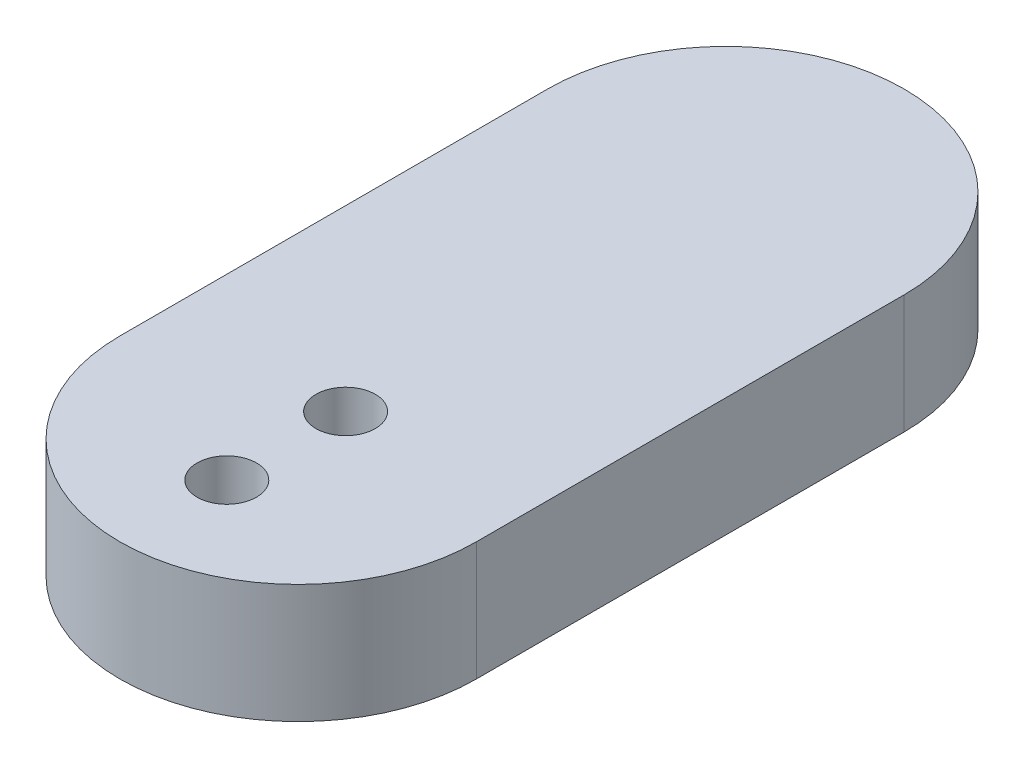
ISO-10303-21;
HEADER;
FILE_DESCRIPTION(('STEP AP214'),'2;1');
FILE_NAME('part.step','',(''),(''),'','','');
FILE_SCHEMA(('AUTOMOTIVE_DESIGN { 1 0 10303 214 1 1 1 1 }'));
ENDSEC;
DATA;
#1=APPLICATION_CONTEXT('core data for automotive mechanical design processes');
#2=APPLICATION_PROTOCOL_DEFINITION('international standard','automotive_design',2000,#1);
#3=PRODUCT_CONTEXT('',#1,'mechanical');
#4=PRODUCT('Part','Part','',(#3));
#5=PRODUCT_RELATED_PRODUCT_CATEGORY('part','',(#4));
#6=PRODUCT_DEFINITION_FORMATION('','',#4);
#7=PRODUCT_DEFINITION_CONTEXT('part definition',#1,'design');
#8=PRODUCT_DEFINITION('design','',#6,#7);
#9=PRODUCT_DEFINITION_SHAPE('','',#8);
#10=(LENGTH_UNIT() NAMED_UNIT(*) SI_UNIT(.MILLI.,.METRE.));
#11=(NAMED_UNIT(*) PLANE_ANGLE_UNIT() SI_UNIT($,.RADIAN.));
#12=(NAMED_UNIT(*) SI_UNIT($,.STERADIAN.) SOLID_ANGLE_UNIT());
#13=UNCERTAINTY_MEASURE_WITH_UNIT(LENGTH_MEASURE(1.E-05),#10,'distance_accuracy_value','');
#14=(GEOMETRIC_REPRESENTATION_CONTEXT(3) GLOBAL_UNCERTAINTY_ASSIGNED_CONTEXT((#13)) GLOBAL_UNIT_ASSIGNED_CONTEXT((#10,
#11,#12)) REPRESENTATION_CONTEXT('',''));
#15=CARTESIAN_POINT('',(0.,0.,0.));
#16=DIRECTION('',(0.,0.,1.));
#17=DIRECTION('',(1.,0.,0.));
#18=AXIS2_PLACEMENT_3D('',#15,#16,#17);
#19=CARTESIAN_POINT('',(7.03742282534219,0.,-10.2319402854921));
#20=DIRECTION('',(0.,1.,0.));
#21=DIRECTION('',(0.,0.,1.));
#22=AXIS2_PLACEMENT_3D('',#19,#20,#21);
#23=PLANE('',#22);
#24=CARTESIAN_POINT('',(7.03742282534219,0.,-10.2319402854921));
#25=DIRECTION('',(0.,1.,0.));
#26=DIRECTION('',(0.,0.,1.));
#27=AXIS2_PLACEMENT_3D('',#24,#25,#26);
#28=CIRCLE('',#27,7.5);
#29=CARTESIAN_POINT('',(14.5374228253422,0.,-10.2319402854921));
#30=VERTEX_POINT('',#29);
#31=CARTESIAN_POINT('',(-0.462577174657807,0.,-10.2319402854921));
#32=VERTEX_POINT('',#31);
#33=EDGE_CURVE('E131',#30,#32,#28,.T.);
#34=ORIENTED_EDGE('',*,*,#33,.F.);
#35=DIRECTION('',(0.,0.,-1.));
#36=VECTOR('',#35,1.);
#37=CARTESIAN_POINT('',(14.5374228253422,0.,-10.2319402854921));
#38=LINE('',#37,#36);
#39=CARTESIAN_POINT('',(14.5374228253422,0.,7.76805971450786));
#40=VERTEX_POINT('',#39);
#41=EDGE_CURVE('E82',#40,#30,#38,.T.);
#42=ORIENTED_EDGE('',*,*,#41,.F.);
#43=CARTESIAN_POINT('',(7.03742282534219,0.,7.76805971450786));
#44=DIRECTION('',(0.,1.,0.));
#45=DIRECTION('',(0.,0.,1.));
#46=AXIS2_PLACEMENT_3D('',#43,#44,#45);
#47=CIRCLE('',#46,7.5);
#48=CARTESIAN_POINT('',(-0.462577174657804,0.,7.76805971450786));
#49=VERTEX_POINT('',#48);
#50=EDGE_CURVE('E149',#49,#40,#47,.T.);
#51=ORIENTED_EDGE('',*,*,#50,.F.);
#52=DIRECTION('',(0.,0.,1.));
#53=VECTOR('',#52,1.);
#54=CARTESIAN_POINT('',(-0.462577174657807,0.,-10.2319402854921));
#55=LINE('',#54,#53);
#56=EDGE_CURVE('E135',#32,#49,#55,.T.);
#57=ORIENTED_EDGE('',*,*,#56,.F.);
#58=EDGE_LOOP('',(#34,#42,#51,#57));
#59=FACE_BOUND('',#58,.T.);
#60=CARTESIAN_POINT('',(7.03742282534219,0.,-10.2319402854921));
#61=DIRECTION('',(0.,1.,0.));
#62=DIRECTION('',(0.,0.,1.));
#63=AXIS2_PLACEMENT_3D('',#60,#61,#62);
#64=CIRCLE('',#63,6.);
#65=CARTESIAN_POINT('',(13.0374228253422,0.,-10.2319402854921));
#66=VERTEX_POINT('',#65);
#67=CARTESIAN_POINT('',(1.03742282534219,0.,-10.2319402854921));
#68=VERTEX_POINT('',#67);
#69=EDGE_CURVE('E52',#66,#68,#64,.T.);
#70=ORIENTED_EDGE('',*,*,#69,.T.);
#71=DIRECTION('',(0.,0.,1.));
#72=VECTOR('',#71,1.);
#73=CARTESIAN_POINT('',(1.03742282534219,0.,-10.2319402854921));
#74=LINE('',#73,#72);
#75=CARTESIAN_POINT('',(1.03742282534219,0.,7.76805971450786));
#76=VERTEX_POINT('',#75);
#77=EDGE_CURVE('E130',#68,#76,#74,.T.);
#78=ORIENTED_EDGE('',*,*,#77,.T.);
#79=CARTESIAN_POINT('',(7.03742282534219,0.,7.76805971450786));
#80=DIRECTION('',(0.,1.,0.));
#81=DIRECTION('',(0.,0.,1.));
#82=AXIS2_PLACEMENT_3D('',#79,#80,#81);
#83=CIRCLE('',#82,6.);
#84=CARTESIAN_POINT('',(13.0374228253422,0.,7.76805971450786));
#85=VERTEX_POINT('',#84);
#86=EDGE_CURVE('E175',#76,#85,#83,.T.);
#87=ORIENTED_EDGE('',*,*,#86,.T.);
#88=DIRECTION('',(0.,0.,-1.));
#89=VECTOR('',#88,1.);
#90=CARTESIAN_POINT('',(13.0374228253422,0.,-10.2319402854921));
#91=LINE('',#90,#89);
#92=EDGE_CURVE('E126',#85,#66,#91,.T.);
#93=ORIENTED_EDGE('',*,*,#92,.T.);
#94=EDGE_LOOP('',(#70,#78,#87,#93));
#95=FACE_BOUND('',#94,.T.);
#96=ADVANCED_FACE('F35',(#59,#95),#23,.F.);
#97=CARTESIAN_POINT('',(7.03742282534219,5.,-10.2319402854921));
#98=DIRECTION('',(0.,-1.,0.));
#99=DIRECTION('',(0.,0.,-1.));
#100=AXIS2_PLACEMENT_3D('',#97,#98,#99);
#101=CYLINDRICAL_SURFACE('',#100,7.5);
#102=ORIENTED_EDGE('',*,*,#33,.T.);
#103=DIRECTION('',(0.,-1.,0.));
#104=VECTOR('',#103,1.);
#105=CARTESIAN_POINT('',(-0.462577174657807,5.,-10.2319402854921));
#106=LINE('',#105,#104);
#107=CARTESIAN_POINT('',(-0.462577174657807,5.,-10.2319402854921));
#108=VERTEX_POINT('',#107);
#109=EDGE_CURVE('E11',#108,#32,#106,.T.);
#110=ORIENTED_EDGE('',*,*,#109,.F.);
#111=CARTESIAN_POINT('',(7.03742282534219,5.,-10.2319402854921));
#112=DIRECTION('',(0.,1.,0.));
#113=DIRECTION('',(0.,0.,1.));
#114=AXIS2_PLACEMENT_3D('',#111,#112,#113);
#115=CIRCLE('',#114,7.5);
#116=CARTESIAN_POINT('',(14.5374228253422,5.,-10.2319402854921));
#117=VERTEX_POINT('',#116);
#118=EDGE_CURVE('E141',#117,#108,#115,.T.);
#119=ORIENTED_EDGE('',*,*,#118,.F.);
#120=DIRECTION('',(0.,-1.,0.));
#121=VECTOR('',#120,1.);
#122=CARTESIAN_POINT('',(14.5374228253422,5.,-10.2319402854921));
#123=LINE('',#122,#121);
#124=EDGE_CURVE('E146',#117,#30,#123,.T.);
#125=ORIENTED_EDGE('',*,*,#124,.T.);
#126=EDGE_LOOP('',(#102,#110,#119,#125));
#127=FACE_BOUND('',#126,.T.);
#128=ADVANCED_FACE('F37',(#127),#101,.T.);
#129=CARTESIAN_POINT('',(-0.462577174657807,5.,-10.2319402854921));
#130=DIRECTION('',(1.,0.,0.));
#131=DIRECTION('',(0.,0.,-1.));
#132=AXIS2_PLACEMENT_3D('',#129,#130,#131);
#133=PLANE('',#132);
#134=ORIENTED_EDGE('',*,*,#56,.T.);
#135=DIRECTION('',(0.,-1.,0.));
#136=VECTOR('',#135,1.);
#137=CARTESIAN_POINT('',(-0.462577174657804,5.,7.76805971450786));
#138=LINE('',#137,#136);
#139=CARTESIAN_POINT('',(-0.462577174657804,5.,7.76805971450786));
#140=VERTEX_POINT('',#139);
#141=EDGE_CURVE('E44',#140,#49,#138,.T.);
#142=ORIENTED_EDGE('',*,*,#141,.F.);
#143=DIRECTION('',(0.,0.,1.));
#144=VECTOR('',#143,1.);
#145=CARTESIAN_POINT('',(-0.462577174657807,5.,-10.2319402854921));
#146=LINE('',#145,#144);
#147=EDGE_CURVE('E89',#108,#140,#146,.T.);
#148=ORIENTED_EDGE('',*,*,#147,.F.);
#149=ORIENTED_EDGE('',*,*,#109,.T.);
#150=EDGE_LOOP('',(#134,#142,#148,#149));
#151=FACE_BOUND('',#150,.T.);
#152=ADVANCED_FACE('F194',(#151),#133,.F.);
#153=CARTESIAN_POINT('',(7.03742282534219,5.,7.76805971450786));
#154=DIRECTION('',(0.,-1.,0.));
#155=DIRECTION('',(0.,0.,-1.));
#156=AXIS2_PLACEMENT_3D('',#153,#154,#155);
#157=CYLINDRICAL_SURFACE('',#156,7.5);
#158=ORIENTED_EDGE('',*,*,#50,.T.);
#159=DIRECTION('',(0.,-1.,0.));
#160=VECTOR('',#159,1.);
#161=CARTESIAN_POINT('',(14.5374228253422,5.,7.76805971450786));
#162=LINE('',#161,#160);
#163=CARTESIAN_POINT('',(14.5374228253422,5.,7.76805971450786));
#164=VERTEX_POINT('',#163);
#165=EDGE_CURVE('E153',#164,#40,#162,.T.);
#166=ORIENTED_EDGE('',*,*,#165,.F.);
#167=CARTESIAN_POINT('',(7.03742282534219,5.,7.76805971450786));
#168=DIRECTION('',(0.,1.,0.));
#169=DIRECTION('',(0.,0.,1.));
#170=AXIS2_PLACEMENT_3D('',#167,#168,#169);
#171=CIRCLE('',#170,7.5);
#172=EDGE_CURVE('E144',#140,#164,#171,.T.);
#173=ORIENTED_EDGE('',*,*,#172,.F.);
#174=ORIENTED_EDGE('',*,*,#141,.T.);
#175=EDGE_LOOP('',(#158,#166,#173,#174));
#176=FACE_BOUND('',#175,.T.);
#177=ADVANCED_FACE('F204',(#176),#157,.T.);
#178=CARTESIAN_POINT('',(14.5374228253422,5.,-10.2319402854921));
#179=DIRECTION('',(-1.,0.,0.));
#180=DIRECTION('',(0.,0.,1.));
#181=AXIS2_PLACEMENT_3D('',#178,#179,#180);
#182=PLANE('',#181);
#183=ORIENTED_EDGE('',*,*,#41,.T.);
#184=ORIENTED_EDGE('',*,*,#124,.F.);
#185=DIRECTION('',(0.,0.,-1.));
#186=VECTOR('',#185,1.);
#187=CARTESIAN_POINT('',(14.5374228253422,5.,-10.2319402854921));
#188=LINE('',#187,#186);
#189=EDGE_CURVE('E61',#164,#117,#188,.T.);
#190=ORIENTED_EDGE('',*,*,#189,.F.);
#191=ORIENTED_EDGE('',*,*,#165,.T.);
#192=EDGE_LOOP('',(#183,#184,#190,#191));
#193=FACE_BOUND('',#192,.T.);
#194=ADVANCED_FACE('F201',(#193),#182,.F.);
#195=CARTESIAN_POINT('',(7.03742282534219,5.,-10.2319402854921));
#196=DIRECTION('',(0.,1.,0.));
#197=DIRECTION('',(0.,0.,1.));
#198=AXIS2_PLACEMENT_3D('',#195,#196,#197);
#199=PLANE('',#198);
#200=CARTESIAN_POINT('',(7.03742282534219,5.,10.7680597145079));
#201=DIRECTION('',(0.,1.,0.));
#202=DIRECTION('',(0.,0.,1.));
#203=AXIS2_PLACEMENT_3D('',#200,#201,#202);
#204=CIRCLE('',#203,1.25);
#205=CARTESIAN_POINT('',(7.03742282534219,5.,12.0180597145079));
#206=VERTEX_POINT('',#205);
#207=EDGE_CURVE('E166',#206,#206,#204,.F.);
#208=ORIENTED_EDGE('',*,*,#207,.T.);
#209=EDGE_LOOP('',(#208));
#210=FACE_BOUND('',#209,.T.);
#211=CARTESIAN_POINT('',(7.03742282534219,5.,5.76805971450787));
#212=DIRECTION('',(0.,1.,0.));
#213=DIRECTION('',(0.,0.,1.));
#214=AXIS2_PLACEMENT_3D('',#211,#212,#213);
#215=CIRCLE('',#214,1.25);
#216=CARTESIAN_POINT('',(7.03742282534219,5.,7.01805971450786));
#217=VERTEX_POINT('',#216);
#218=EDGE_CURVE('E158',#217,#217,#215,.F.);
#219=ORIENTED_EDGE('',*,*,#218,.T.);
#220=EDGE_LOOP('',(#219));
#221=FACE_BOUND('',#220,.T.);
#222=ORIENTED_EDGE('',*,*,#118,.T.);
#223=ORIENTED_EDGE('',*,*,#147,.T.);
#224=ORIENTED_EDGE('',*,*,#172,.T.);
#225=ORIENTED_EDGE('',*,*,#189,.T.);
#226=EDGE_LOOP('',(#222,#223,#224,#225));
#227=FACE_BOUND('',#226,.T.);
#228=ADVANCED_FACE('F199',(#210,#221,#227),#199,.T.);
#229=CARTESIAN_POINT('',(7.03742282534219,3.,-10.2319402854921));
#230=DIRECTION('',(0.,-1.,0.));
#231=DIRECTION('',(0.,0.,-1.));
#232=AXIS2_PLACEMENT_3D('',#229,#230,#231);
#233=CYLINDRICAL_SURFACE('',#232,6.);
#234=ORIENTED_EDGE('',*,*,#69,.F.);
#235=DIRECTION('',(0.,-1.,0.));
#236=VECTOR('',#235,1.);
#237=CARTESIAN_POINT('',(13.0374228253422,3.,-10.2319402854921));
#238=LINE('',#237,#236);
#239=CARTESIAN_POINT('',(13.0374228253422,3.,-10.2319402854921));
#240=VERTEX_POINT('',#239);
#241=EDGE_CURVE('E125',#240,#66,#238,.T.);
#242=ORIENTED_EDGE('',*,*,#241,.F.);
#243=CARTESIAN_POINT('',(7.03742282534219,3.,-10.2319402854921));
#244=DIRECTION('',(0.,1.,0.));
#245=DIRECTION('',(0.,0.,1.));
#246=AXIS2_PLACEMENT_3D('',#243,#244,#245);
#247=CIRCLE('',#246,6.);
#248=CARTESIAN_POINT('',(1.03742282534219,3.,-10.2319402854921));
#249=VERTEX_POINT('',#248);
#250=EDGE_CURVE('E117',#240,#249,#247,.T.);
#251=ORIENTED_EDGE('',*,*,#250,.T.);
#252=DIRECTION('',(0.,-1.,0.));
#253=VECTOR('',#252,1.);
#254=CARTESIAN_POINT('',(1.03742282534219,3.,-10.2319402854921));
#255=LINE('',#254,#253);
#256=EDGE_CURVE('E124',#249,#68,#255,.T.);
#257=ORIENTED_EDGE('',*,*,#256,.T.);
#258=EDGE_LOOP('',(#234,#242,#251,#257));
#259=FACE_BOUND('',#258,.T.);
#260=ADVANCED_FACE('F123',(#259),#233,.F.);
#261=CARTESIAN_POINT('',(1.03742282534219,3.,-10.2319402854921));
#262=DIRECTION('',(1.,0.,0.));
#263=DIRECTION('',(0.,0.,-1.));
#264=AXIS2_PLACEMENT_3D('',#261,#262,#263);
#265=PLANE('',#264);
#266=ORIENTED_EDGE('',*,*,#77,.F.);
#267=ORIENTED_EDGE('',*,*,#256,.F.);
#268=DIRECTION('',(0.,0.,1.));
#269=VECTOR('',#268,1.);
#270=CARTESIAN_POINT('',(1.03742282534219,3.,-10.2319402854921));
#271=LINE('',#270,#269);
#272=CARTESIAN_POINT('',(1.03742282534219,3.,7.76805971450786));
#273=VERTEX_POINT('',#272);
#274=EDGE_CURVE('E113',#249,#273,#271,.T.);
#275=ORIENTED_EDGE('',*,*,#274,.T.);
#276=DIRECTION('',(0.,-1.,0.));
#277=VECTOR('',#276,1.);
#278=CARTESIAN_POINT('',(1.03742282534219,3.,7.76805971450786));
#279=LINE('',#278,#277);
#280=EDGE_CURVE('E132',#273,#76,#279,.T.);
#281=ORIENTED_EDGE('',*,*,#280,.T.);
#282=EDGE_LOOP('',(#266,#267,#275,#281));
#283=FACE_BOUND('',#282,.T.);
#284=ADVANCED_FACE('F128',(#283),#265,.T.);
#285=CARTESIAN_POINT('',(7.03742282534219,3.,7.76805971450786));
#286=DIRECTION('',(0.,-1.,0.));
#287=DIRECTION('',(0.,0.,-1.));
#288=AXIS2_PLACEMENT_3D('',#285,#286,#287);
#289=CYLINDRICAL_SURFACE('',#288,6.);
#290=ORIENTED_EDGE('',*,*,#86,.F.);
#291=ORIENTED_EDGE('',*,*,#280,.F.);
#292=CARTESIAN_POINT('',(7.03742282534219,3.,7.76805971450786));
#293=DIRECTION('',(0.,1.,0.));
#294=DIRECTION('',(0.,0.,1.));
#295=AXIS2_PLACEMENT_3D('',#292,#293,#294);
#296=CIRCLE('',#295,6.);
#297=CARTESIAN_POINT('',(13.0374228253422,3.,7.76805971450786));
#298=VERTEX_POINT('',#297);
#299=EDGE_CURVE('E118',#273,#298,#296,.T.);
#300=ORIENTED_EDGE('',*,*,#299,.T.);
#301=DIRECTION('',(0.,-1.,0.));
#302=VECTOR('',#301,1.);
#303=CARTESIAN_POINT('',(13.0374228253422,3.,7.76805971450786));
#304=LINE('',#303,#302);
#305=EDGE_CURVE('E137',#298,#85,#304,.T.);
#306=ORIENTED_EDGE('',*,*,#305,.T.);
#307=EDGE_LOOP('',(#290,#291,#300,#306));
#308=FACE_BOUND('',#307,.T.);
#309=ADVANCED_FACE('F184',(#308),#289,.F.);
#310=CARTESIAN_POINT('',(13.0374228253422,3.,-10.2319402854921));
#311=DIRECTION('',(-1.,0.,0.));
#312=DIRECTION('',(0.,0.,1.));
#313=AXIS2_PLACEMENT_3D('',#310,#311,#312);
#314=PLANE('',#313);
#315=ORIENTED_EDGE('',*,*,#92,.F.);
#316=ORIENTED_EDGE('',*,*,#305,.F.);
#317=DIRECTION('',(0.,0.,-1.));
#318=VECTOR('',#317,1.);
#319=CARTESIAN_POINT('',(13.0374228253422,3.,-10.2319402854921));
#320=LINE('',#319,#318);
#321=EDGE_CURVE('E171',#298,#240,#320,.T.);
#322=ORIENTED_EDGE('',*,*,#321,.T.);
#323=ORIENTED_EDGE('',*,*,#241,.T.);
#324=EDGE_LOOP('',(#315,#316,#322,#323));
#325=FACE_BOUND('',#324,.T.);
#326=ADVANCED_FACE('F186',(#325),#314,.T.);
#327=CARTESIAN_POINT('',(7.03742282534219,3.,-10.2319402854921));
#328=DIRECTION('',(0.,1.,0.));
#329=DIRECTION('',(0.,0.,1.));
#330=AXIS2_PLACEMENT_3D('',#327,#328,#329);
#331=PLANE('',#330);
#332=CARTESIAN_POINT('',(7.03742282534219,3.,10.7680597145079));
#333=DIRECTION('',(0.,1.,0.));
#334=DIRECTION('',(0.,0.,1.));
#335=AXIS2_PLACEMENT_3D('',#332,#333,#334);
#336=CIRCLE('',#335,1.25);
#337=CARTESIAN_POINT('',(7.03742282534219,3.,12.0180597145079));
#338=VERTEX_POINT('',#337);
#339=EDGE_CURVE('E39',#338,#338,#336,.F.);
#340=ORIENTED_EDGE('',*,*,#339,.F.);
#341=EDGE_LOOP('',(#340));
#342=FACE_BOUND('',#341,.T.);
#343=CARTESIAN_POINT('',(7.03742282534219,3.,5.76805971450787));
#344=DIRECTION('',(0.,1.,0.));
#345=DIRECTION('',(0.,0.,1.));
#346=AXIS2_PLACEMENT_3D('',#343,#344,#345);
#347=CIRCLE('',#346,1.25);
#348=CARTESIAN_POINT('',(7.03742282534219,3.,7.01805971450786));
#349=VERTEX_POINT('',#348);
#350=EDGE_CURVE('E156',#349,#349,#347,.F.);
#351=ORIENTED_EDGE('',*,*,#350,.F.);
#352=EDGE_LOOP('',(#351));
#353=FACE_BOUND('',#352,.T.);
#354=ORIENTED_EDGE('',*,*,#250,.F.);
#355=ORIENTED_EDGE('',*,*,#321,.F.);
#356=ORIENTED_EDGE('',*,*,#299,.F.);
#357=ORIENTED_EDGE('',*,*,#274,.F.);
#358=EDGE_LOOP('',(#354,#355,#356,#357));
#359=FACE_BOUND('',#358,.T.);
#360=ADVANCED_FACE('F115',(#342,#353,#359),#331,.F.);
#361=CARTESIAN_POINT('',(7.03742282534219,0.,5.76805971450787));
#362=DIRECTION('',(0.,1.,0.));
#363=DIRECTION('',(0.,0.,1.));
#364=AXIS2_PLACEMENT_3D('',#361,#362,#363);
#365=CYLINDRICAL_SURFACE('',#364,1.25);
#366=ORIENTED_EDGE('',*,*,#218,.F.);
#367=EDGE_LOOP('',(#366));
#368=FACE_BOUND('',#367,.T.);
#369=ORIENTED_EDGE('',*,*,#350,.T.);
#370=EDGE_LOOP('',(#369));
#371=FACE_BOUND('',#370,.T.);
#372=ADVANCED_FACE('F225',(#368,#371),#365,.F.);
#373=CARTESIAN_POINT('',(7.03742282534219,0.,10.7680597145079));
#374=DIRECTION('',(0.,1.,0.));
#375=DIRECTION('',(0.,0.,1.));
#376=AXIS2_PLACEMENT_3D('',#373,#374,#375);
#377=CYLINDRICAL_SURFACE('',#376,1.25);
#378=ORIENTED_EDGE('',*,*,#207,.F.);
#379=EDGE_LOOP('',(#378));
#380=FACE_BOUND('',#379,.T.);
#381=ORIENTED_EDGE('',*,*,#339,.T.);
#382=EDGE_LOOP('',(#381));
#383=FACE_BOUND('',#382,.T.);
#384=ADVANCED_FACE('F222',(#380,#383),#377,.F.);
#385=CLOSED_SHELL('',(#96,#128,#152,#177,#194,#228,#260,#284,#309,#326,#360,#372,#384));
#386=MANIFOLD_SOLID_BREP('B2',#385);
#387=ADVANCED_BREP_SHAPE_REPRESENTATION('',(#18,#386),#14);
#388=SHAPE_DEFINITION_REPRESENTATION(#9,#387);
ENDSEC;
END-ISO-10303-21;
